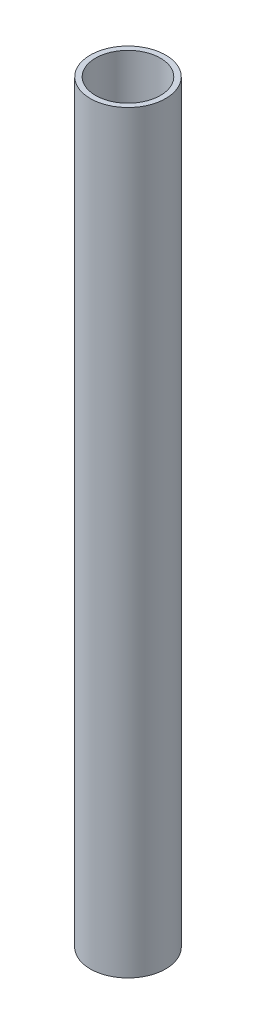
ISO-10303-21;
HEADER;
FILE_DESCRIPTION(('STEP AP214'),'2;1');
FILE_NAME('part.step','',(''),(''),'','','');
FILE_SCHEMA(('AUTOMOTIVE_DESIGN { 1 0 10303 214 1 1 1 1 }'));
ENDSEC;
DATA;
#1=APPLICATION_CONTEXT('core data for automotive mechanical design processes');
#2=APPLICATION_PROTOCOL_DEFINITION('international standard','automotive_design',2000,#1);
#3=PRODUCT_CONTEXT('',#1,'mechanical');
#4=PRODUCT('Part','Part','',(#3));
#5=PRODUCT_RELATED_PRODUCT_CATEGORY('part','',(#4));
#6=PRODUCT_DEFINITION_FORMATION('','',#4);
#7=PRODUCT_DEFINITION_CONTEXT('part definition',#1,'design');
#8=PRODUCT_DEFINITION('design','',#6,#7);
#9=PRODUCT_DEFINITION_SHAPE('','',#8);
#10=(LENGTH_UNIT() NAMED_UNIT(*) SI_UNIT(.MILLI.,.METRE.));
#11=(NAMED_UNIT(*) PLANE_ANGLE_UNIT() SI_UNIT($,.RADIAN.));
#12=(NAMED_UNIT(*) SI_UNIT($,.STERADIAN.) SOLID_ANGLE_UNIT());
#13=UNCERTAINTY_MEASURE_WITH_UNIT(LENGTH_MEASURE(1.E-05),#10,'distance_accuracy_value','');
#14=(GEOMETRIC_REPRESENTATION_CONTEXT(3) GLOBAL_UNCERTAINTY_ASSIGNED_CONTEXT((#13)) GLOBAL_UNIT_ASSIGNED_CONTEXT((#10,
#11,#12)) REPRESENTATION_CONTEXT('',''));
#15=CARTESIAN_POINT('',(0.,0.,0.));
#16=DIRECTION('',(0.,0.,1.));
#17=DIRECTION('',(1.,0.,0.));
#18=AXIS2_PLACEMENT_3D('',#15,#16,#17);
#19=CARTESIAN_POINT('',(0.,127.,0.));
#20=DIRECTION('',(0.,-1.,0.));
#21=DIRECTION('',(0.,0.,-1.));
#22=AXIS2_PLACEMENT_3D('',#19,#20,#21);
#23=CYLINDRICAL_SURFACE('',#22,6.35);
#24=CARTESIAN_POINT('',(0.,127.,0.));
#25=DIRECTION('',(0.,1.,0.));
#26=DIRECTION('',(0.,0.,1.));
#27=AXIS2_PLACEMENT_3D('',#24,#25,#26);
#28=CIRCLE('',#27,6.35);
#29=CARTESIAN_POINT('',(0.,127.,6.35));
#30=VERTEX_POINT('',#29);
#31=EDGE_CURVE('E10',#30,#30,#28,.T.);
#32=ORIENTED_EDGE('',*,*,#31,.F.);
#33=EDGE_LOOP('',(#32));
#34=FACE_BOUND('',#33,.T.);
#35=CARTESIAN_POINT('',(0.,0.,0.));
#36=DIRECTION('',(0.,1.,0.));
#37=DIRECTION('',(0.,0.,1.));
#38=AXIS2_PLACEMENT_3D('',#35,#36,#37);
#39=CIRCLE('',#38,6.35);
#40=CARTESIAN_POINT('',(0.,0.,6.35));
#41=VERTEX_POINT('',#40);
#42=EDGE_CURVE('E37',#41,#41,#39,.T.);
#43=ORIENTED_EDGE('',*,*,#42,.T.);
#44=EDGE_LOOP('',(#43));
#45=FACE_BOUND('',#44,.T.);
#46=ADVANCED_FACE('F34',(#34,#45),#23,.T.);
#47=CARTESIAN_POINT('',(0.,127.,0.));
#48=DIRECTION('',(0.,1.,0.));
#49=DIRECTION('',(0.,0.,1.));
#50=AXIS2_PLACEMENT_3D('',#47,#48,#49);
#51=PLANE('',#50);
#52=CARTESIAN_POINT('',(0.,127.,0.));
#53=DIRECTION('',(0.,1.,0.));
#54=DIRECTION('',(0.,0.,1.));
#55=AXIS2_PLACEMENT_3D('',#52,#53,#54);
#56=CIRCLE('',#55,5.461);
#57=CARTESIAN_POINT('',(0.,127.,5.461));
#58=VERTEX_POINT('',#57);
#59=EDGE_CURVE('E46',#58,#58,#56,.T.);
#60=ORIENTED_EDGE('',*,*,#59,.F.);
#61=EDGE_LOOP('',(#60));
#62=FACE_BOUND('',#61,.T.);
#63=ORIENTED_EDGE('',*,*,#31,.T.);
#64=EDGE_LOOP('',(#63));
#65=FACE_BOUND('',#64,.T.);
#66=ADVANCED_FACE('F61',(#62,#65),#51,.T.);
#67=CARTESIAN_POINT('',(0.,0.,0.));
#68=DIRECTION('',(0.,1.,0.));
#69=DIRECTION('',(0.,0.,1.));
#70=AXIS2_PLACEMENT_3D('',#67,#68,#69);
#71=PLANE('',#70);
#72=CARTESIAN_POINT('',(0.,0.,0.));
#73=DIRECTION('',(0.,1.,0.));
#74=DIRECTION('',(0.,0.,1.));
#75=AXIS2_PLACEMENT_3D('',#72,#73,#74);
#76=CIRCLE('',#75,5.461);
#77=CARTESIAN_POINT('',(0.,0.,5.461));
#78=VERTEX_POINT('',#77);
#79=EDGE_CURVE('E44',#78,#78,#76,.T.);
#80=ORIENTED_EDGE('',*,*,#79,.T.);
#81=EDGE_LOOP('',(#80));
#82=FACE_BOUND('',#81,.T.);
#83=ORIENTED_EDGE('',*,*,#42,.F.);
#84=EDGE_LOOP('',(#83));
#85=FACE_BOUND('',#84,.T.);
#86=ADVANCED_FACE('F52',(#82,#85),#71,.F.);
#87=CARTESIAN_POINT('',(0.,0.,0.));
#88=DIRECTION('',(0.,1.,0.));
#89=DIRECTION('',(0.,0.,1.));
#90=AXIS2_PLACEMENT_3D('',#87,#88,#89);
#91=CYLINDRICAL_SURFACE('',#90,5.461);
#92=ORIENTED_EDGE('',*,*,#79,.F.);
#93=EDGE_LOOP('',(#92));
#94=FACE_BOUND('',#93,.T.);
#95=ORIENTED_EDGE('',*,*,#59,.T.);
#96=EDGE_LOOP('',(#95));
#97=FACE_BOUND('',#96,.T.);
#98=ADVANCED_FACE('F55',(#94,#97),#91,.F.);
#99=CLOSED_SHELL('',(#46,#66,#86,#98));
#100=MANIFOLD_SOLID_BREP('B2',#99);
#101=ADVANCED_BREP_SHAPE_REPRESENTATION('',(#18,#100),#14);
#102=SHAPE_DEFINITION_REPRESENTATION(#9,#101);
ENDSEC;
END-ISO-10303-21;
